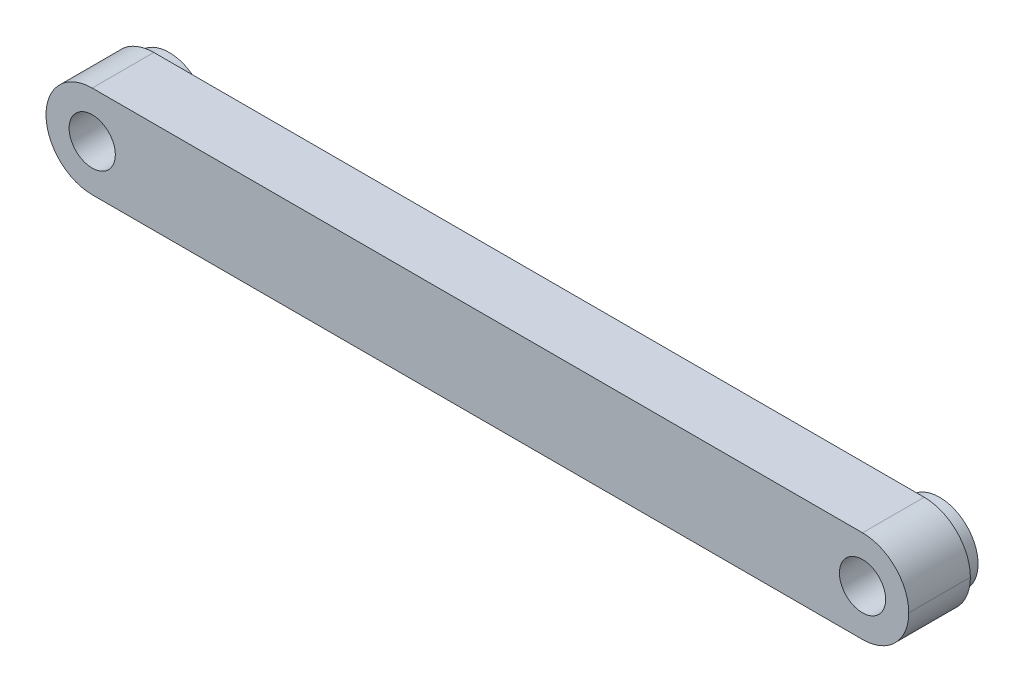
ISO-10303-21;
HEADER;
FILE_DESCRIPTION(('STEP AP214'),'2;1');
FILE_NAME('part.step','',(''),(''),'','','');
FILE_SCHEMA(('AUTOMOTIVE_DESIGN { 1 0 10303 214 1 1 1 1 }'));
ENDSEC;
DATA;
#1=APPLICATION_CONTEXT('core data for automotive mechanical design processes');
#2=APPLICATION_PROTOCOL_DEFINITION('international standard','automotive_design',2000,#1);
#3=PRODUCT_CONTEXT('',#1,'mechanical');
#4=PRODUCT('Part','Part','',(#3));
#5=PRODUCT_RELATED_PRODUCT_CATEGORY('part','',(#4));
#6=PRODUCT_DEFINITION_FORMATION('','',#4);
#7=PRODUCT_DEFINITION_CONTEXT('part definition',#1,'design');
#8=PRODUCT_DEFINITION('design','',#6,#7);
#9=PRODUCT_DEFINITION_SHAPE('','',#8);
#10=(LENGTH_UNIT() NAMED_UNIT(*) SI_UNIT(.MILLI.,.METRE.));
#11=(NAMED_UNIT(*) PLANE_ANGLE_UNIT() SI_UNIT($,.RADIAN.));
#12=(NAMED_UNIT(*) SI_UNIT($,.STERADIAN.) SOLID_ANGLE_UNIT());
#13=UNCERTAINTY_MEASURE_WITH_UNIT(LENGTH_MEASURE(1.E-05),#10,'distance_accuracy_value','');
#14=(GEOMETRIC_REPRESENTATION_CONTEXT(3) GLOBAL_UNCERTAINTY_ASSIGNED_CONTEXT((#13)) GLOBAL_UNIT_ASSIGNED_CONTEXT((#10,
#11,#12)) REPRESENTATION_CONTEXT('',''));
#15=CARTESIAN_POINT('',(0.,0.,0.));
#16=DIRECTION('',(0.,0.,1.));
#17=DIRECTION('',(1.,0.,0.));
#18=AXIS2_PLACEMENT_3D('',#15,#16,#17);
#19=CARTESIAN_POINT('',(0.,0.,0.));
#20=DIRECTION('',(0.,0.,-1.));
#21=DIRECTION('',(-1.,0.,0.));
#22=AXIS2_PLACEMENT_3D('',#19,#20,#21);
#23=PLANE('',#22);
#24=CARTESIAN_POINT('',(-25.,0.,0.));
#25=DIRECTION('',(0.,0.,-1.));
#26=DIRECTION('',(-1.,0.,0.));
#27=AXIS2_PLACEMENT_3D('',#24,#25,#26);
#28=CIRCLE('',#27,2.5);
#29=CARTESIAN_POINT('',(-27.5,0.,0.));
#30=VERTEX_POINT('',#29);
#31=EDGE_CURVE('E11',#30,#30,#28,.T.);
#32=ORIENTED_EDGE('',*,*,#31,.F.);
#33=EDGE_LOOP('',(#32));
#34=FACE_BOUND('',#33,.T.);
#35=CARTESIAN_POINT('',(25.,0.,0.));
#36=DIRECTION('',(0.,0.,-1.));
#37=DIRECTION('',(-1.,0.,0.));
#38=AXIS2_PLACEMENT_3D('',#35,#36,#37);
#39=CIRCLE('',#38,3.);
#40=CARTESIAN_POINT('',(25.,3.,0.));
#41=VERTEX_POINT('',#40);
#42=CARTESIAN_POINT('',(28.,0.,0.));
#43=VERTEX_POINT('',#42);
#44=EDGE_CURVE('E103',#41,#43,#39,.T.);
#45=ORIENTED_EDGE('',*,*,#44,.T.);
#46=CARTESIAN_POINT('',(25.,0.,0.));
#47=DIRECTION('',(0.,0.,-1.));
#48=DIRECTION('',(-1.,0.,0.));
#49=AXIS2_PLACEMENT_3D('',#46,#47,#48);
#50=CIRCLE('',#49,3.);
#51=CARTESIAN_POINT('',(25.,-3.,0.));
#52=VERTEX_POINT('',#51);
#53=EDGE_CURVE('E108',#43,#52,#50,.T.);
#54=ORIENTED_EDGE('',*,*,#53,.T.);
#55=DIRECTION('',(1.,0.,0.));
#56=VECTOR('',#55,1.);
#57=CARTESIAN_POINT('',(-28.,-3.,0.));
#58=LINE('',#57,#56);
#59=CARTESIAN_POINT('',(-25.,-3.,0.));
#60=VERTEX_POINT('',#59);
#61=EDGE_CURVE('E155',#60,#52,#58,.T.);
#62=ORIENTED_EDGE('',*,*,#61,.F.);
#63=CARTESIAN_POINT('',(-25.,0.,0.));
#64=DIRECTION('',(0.,0.,-1.));
#65=DIRECTION('',(-1.,0.,0.));
#66=AXIS2_PLACEMENT_3D('',#63,#64,#65);
#67=CIRCLE('',#66,3.);
#68=CARTESIAN_POINT('',(-28.,0.,0.));
#69=VERTEX_POINT('',#68);
#70=EDGE_CURVE('E114',#60,#69,#67,.T.);
#71=ORIENTED_EDGE('',*,*,#70,.T.);
#72=CARTESIAN_POINT('',(-25.,0.,0.));
#73=DIRECTION('',(0.,0.,-1.));
#74=DIRECTION('',(-1.,0.,0.));
#75=AXIS2_PLACEMENT_3D('',#72,#73,#74);
#76=CIRCLE('',#75,3.);
#77=CARTESIAN_POINT('',(-25.,3.,0.));
#78=VERTEX_POINT('',#77);
#79=EDGE_CURVE('E160',#69,#78,#76,.T.);
#80=ORIENTED_EDGE('',*,*,#79,.T.);
#81=DIRECTION('',(-1.,0.,0.));
#82=VECTOR('',#81,1.);
#83=CARTESIAN_POINT('',(-28.,3.,0.));
#84=LINE('',#83,#82);
#85=EDGE_CURVE('E110',#41,#78,#84,.T.);
#86=ORIENTED_EDGE('',*,*,#85,.F.);
#87=EDGE_LOOP('',(#45,#54,#62,#71,#80,#86));
#88=FACE_BOUND('',#87,.T.);
#89=CARTESIAN_POINT('',(25.,0.,0.));
#90=DIRECTION('',(0.,0.,-1.));
#91=DIRECTION('',(-1.,0.,0.));
#92=AXIS2_PLACEMENT_3D('',#89,#90,#91);
#93=CIRCLE('',#92,2.5);
#94=CARTESIAN_POINT('',(22.5,0.,0.));
#95=VERTEX_POINT('',#94);
#96=EDGE_CURVE('E191',#95,#95,#93,.T.);
#97=ORIENTED_EDGE('',*,*,#96,.F.);
#98=EDGE_LOOP('',(#97));
#99=FACE_BOUND('',#98,.T.);
#100=ADVANCED_FACE('F45',(#34,#88,#99),#23,.T.);
#101=CARTESIAN_POINT('',(0.,0.,4.));
#102=DIRECTION('',(0.,0.,-1.));
#103=DIRECTION('',(-1.,0.,0.));
#104=AXIS2_PLACEMENT_3D('',#101,#102,#103);
#105=PLANE('',#104);
#106=DIRECTION('',(1.,0.,0.));
#107=VECTOR('',#106,1.);
#108=CARTESIAN_POINT('',(-28.,-3.,4.));
#109=LINE('',#108,#107);
#110=CARTESIAN_POINT('',(-25.,-3.,4.));
#111=VERTEX_POINT('',#110);
#112=CARTESIAN_POINT('',(25.,-3.,4.));
#113=VERTEX_POINT('',#112);
#114=EDGE_CURVE('E154',#111,#113,#109,.T.);
#115=ORIENTED_EDGE('',*,*,#114,.T.);
#116=CARTESIAN_POINT('',(25.,0.,4.));
#117=DIRECTION('',(0.,0.,-1.));
#118=DIRECTION('',(-1.,0.,0.));
#119=AXIS2_PLACEMENT_3D('',#116,#117,#118);
#120=CIRCLE('',#119,3.);
#121=CARTESIAN_POINT('',(28.,0.,4.));
#122=VERTEX_POINT('',#121);
#123=EDGE_CURVE('E145',#113,#122,#120,.F.);
#124=ORIENTED_EDGE('',*,*,#123,.T.);
#125=CARTESIAN_POINT('',(25.,0.,4.));
#126=DIRECTION('',(0.,0.,-1.));
#127=DIRECTION('',(-1.,0.,0.));
#128=AXIS2_PLACEMENT_3D('',#125,#126,#127);
#129=CIRCLE('',#128,3.);
#130=CARTESIAN_POINT('',(25.,3.,4.));
#131=VERTEX_POINT('',#130);
#132=EDGE_CURVE('E120',#122,#131,#129,.F.);
#133=ORIENTED_EDGE('',*,*,#132,.T.);
#134=DIRECTION('',(-1.,0.,0.));
#135=VECTOR('',#134,1.);
#136=CARTESIAN_POINT('',(-28.,3.,4.));
#137=LINE('',#136,#135);
#138=CARTESIAN_POINT('',(-25.,3.,4.));
#139=VERTEX_POINT('',#138);
#140=EDGE_CURVE('E152',#131,#139,#137,.T.);
#141=ORIENTED_EDGE('',*,*,#140,.T.);
#142=CARTESIAN_POINT('',(-25.,0.,4.));
#143=DIRECTION('',(0.,0.,-1.));
#144=DIRECTION('',(-1.,0.,0.));
#145=AXIS2_PLACEMENT_3D('',#142,#143,#144);
#146=CIRCLE('',#145,3.);
#147=CARTESIAN_POINT('',(-28.,0.,4.));
#148=VERTEX_POINT('',#147);
#149=EDGE_CURVE('E63',#139,#148,#146,.F.);
#150=ORIENTED_EDGE('',*,*,#149,.T.);
#151=CARTESIAN_POINT('',(-25.,0.,4.));
#152=DIRECTION('',(0.,0.,-1.));
#153=DIRECTION('',(-1.,0.,0.));
#154=AXIS2_PLACEMENT_3D('',#151,#152,#153);
#155=CIRCLE('',#154,3.);
#156=EDGE_CURVE('E140',#148,#111,#155,.F.);
#157=ORIENTED_EDGE('',*,*,#156,.T.);
#158=EDGE_LOOP('',(#115,#124,#133,#141,#150,#157));
#159=FACE_BOUND('',#158,.T.);
#160=CARTESIAN_POINT('',(-25.,0.,4.));
#161=DIRECTION('',(0.,0.,1.));
#162=DIRECTION('',(1.,0.,0.));
#163=AXIS2_PLACEMENT_3D('',#160,#161,#162);
#164=CIRCLE('',#163,1.5);
#165=CARTESIAN_POINT('',(-23.5,0.,4.));
#166=VERTEX_POINT('',#165);
#167=EDGE_CURVE('E164',#166,#166,#164,.T.);
#168=ORIENTED_EDGE('',*,*,#167,.F.);
#169=EDGE_LOOP('',(#168));
#170=FACE_BOUND('',#169,.T.);
#171=CARTESIAN_POINT('',(25.,0.,4.));
#172=DIRECTION('',(0.,0.,1.));
#173=DIRECTION('',(1.,0.,0.));
#174=AXIS2_PLACEMENT_3D('',#171,#172,#173);
#175=CIRCLE('',#174,1.5);
#176=CARTESIAN_POINT('',(26.5,0.,4.));
#177=VERTEX_POINT('',#176);
#178=EDGE_CURVE('E123',#177,#177,#175,.T.);
#179=ORIENTED_EDGE('',*,*,#178,.F.);
#180=EDGE_LOOP('',(#179));
#181=FACE_BOUND('',#180,.T.);
#182=ADVANCED_FACE('F212',(#159,#170,#181),#105,.F.);
#183=CARTESIAN_POINT('',(-28.,3.,4.));
#184=DIRECTION('',(0.,-1.,0.));
#185=DIRECTION('',(0.,0.,-1.));
#186=AXIS2_PLACEMENT_3D('',#183,#184,#185);
#187=PLANE('',#186);
#188=ORIENTED_EDGE('',*,*,#140,.F.);
#189=DIRECTION('',(0.,0.,-1.));
#190=VECTOR('',#189,1.);
#191=CARTESIAN_POINT('',(25.,3.,4.));
#192=LINE('',#191,#190);
#193=EDGE_CURVE('E55',#131,#41,#192,.T.);
#194=ORIENTED_EDGE('',*,*,#193,.T.);
#195=ORIENTED_EDGE('',*,*,#85,.T.);
#196=DIRECTION('',(0.,0.,-1.));
#197=VECTOR('',#196,1.);
#198=CARTESIAN_POINT('',(-25.,3.,4.));
#199=LINE('',#198,#197);
#200=EDGE_CURVE('E71',#78,#139,#199,.F.);
#201=ORIENTED_EDGE('',*,*,#200,.T.);
#202=EDGE_LOOP('',(#188,#194,#195,#201));
#203=FACE_BOUND('',#202,.T.);
#204=ADVANCED_FACE('F151',(#203),#187,.F.);
#205=CARTESIAN_POINT('',(-28.,-3.,4.));
#206=DIRECTION('',(0.,1.,0.));
#207=DIRECTION('',(0.,0.,1.));
#208=AXIS2_PLACEMENT_3D('',#205,#206,#207);
#209=PLANE('',#208);
#210=ORIENTED_EDGE('',*,*,#61,.T.);
#211=DIRECTION('',(0.,0.,-1.));
#212=VECTOR('',#211,1.);
#213=CARTESIAN_POINT('',(25.,-3.,4.));
#214=LINE('',#213,#212);
#215=EDGE_CURVE('E127',#52,#113,#214,.F.);
#216=ORIENTED_EDGE('',*,*,#215,.T.);
#217=ORIENTED_EDGE('',*,*,#114,.F.);
#218=DIRECTION('',(0.,0.,-1.));
#219=VECTOR('',#218,1.);
#220=CARTESIAN_POINT('',(-25.,-3.,4.));
#221=LINE('',#220,#219);
#222=EDGE_CURVE('E129',#111,#60,#221,.T.);
#223=ORIENTED_EDGE('',*,*,#222,.T.);
#224=EDGE_LOOP('',(#210,#216,#217,#223));
#225=FACE_BOUND('',#224,.T.);
#226=ADVANCED_FACE('F219',(#225),#209,.F.);
#227=CARTESIAN_POINT('',(-25.,0.,4.));
#228=DIRECTION('',(0.,0.,-1.));
#229=DIRECTION('',(-1.,0.,0.));
#230=AXIS2_PLACEMENT_3D('',#227,#228,#229);
#231=CYLINDRICAL_SURFACE('',#230,1.5);
#232=ORIENTED_EDGE('',*,*,#167,.T.);
#233=EDGE_LOOP('',(#232));
#234=FACE_BOUND('',#233,.T.);
#235=CARTESIAN_POINT('',(-25.,0.,-1.));
#236=DIRECTION('',(0.,0.,-1.));
#237=DIRECTION('',(-1.,0.,0.));
#238=AXIS2_PLACEMENT_3D('',#235,#236,#237);
#239=CIRCLE('',#238,1.5);
#240=CARTESIAN_POINT('',(-26.5,0.,-1.));
#241=VERTEX_POINT('',#240);
#242=EDGE_CURVE('E182',#241,#241,#239,.T.);
#243=ORIENTED_EDGE('',*,*,#242,.T.);
#244=EDGE_LOOP('',(#243));
#245=FACE_BOUND('',#244,.T.);
#246=ADVANCED_FACE('F209',(#234,#245),#231,.F.);
#247=CARTESIAN_POINT('',(25.,0.,4.));
#248=DIRECTION('',(0.,0.,-1.));
#249=DIRECTION('',(-1.,0.,0.));
#250=AXIS2_PLACEMENT_3D('',#247,#248,#249);
#251=CYLINDRICAL_SURFACE('',#250,1.5);
#252=ORIENTED_EDGE('',*,*,#178,.T.);
#253=EDGE_LOOP('',(#252));
#254=FACE_BOUND('',#253,.T.);
#255=CARTESIAN_POINT('',(25.,0.,-1.));
#256=DIRECTION('',(0.,0.,-1.));
#257=DIRECTION('',(-1.,0.,0.));
#258=AXIS2_PLACEMENT_3D('',#255,#256,#257);
#259=CIRCLE('',#258,1.5);
#260=CARTESIAN_POINT('',(23.5,0.,-1.));
#261=VERTEX_POINT('',#260);
#262=EDGE_CURVE('E188',#261,#261,#259,.T.);
#263=ORIENTED_EDGE('',*,*,#262,.T.);
#264=EDGE_LOOP('',(#263));
#265=FACE_BOUND('',#264,.T.);
#266=ADVANCED_FACE('F233',(#254,#265),#251,.F.);
#267=CARTESIAN_POINT('',(25.,0.,4.));
#268=DIRECTION('',(0.,0.,-1.));
#269=DIRECTION('',(-1.,0.,0.));
#270=AXIS2_PLACEMENT_3D('',#267,#268,#269);
#271=CYLINDRICAL_SURFACE('',#270,3.);
#272=ORIENTED_EDGE('',*,*,#193,.F.);
#273=ORIENTED_EDGE('',*,*,#132,.F.);
#274=DIRECTION('',(0.,0.,-1.));
#275=VECTOR('',#274,1.);
#276=CARTESIAN_POINT('',(28.,0.,4.));
#277=LINE('',#276,#275);
#278=EDGE_CURVE('E118',#43,#122,#277,.F.);
#279=ORIENTED_EDGE('',*,*,#278,.F.);
#280=ORIENTED_EDGE('',*,*,#44,.F.);
#281=EDGE_LOOP('',(#272,#273,#279,#280));
#282=FACE_BOUND('',#281,.T.);
#283=ADVANCED_FACE('F119',(#282),#271,.T.);
#284=CARTESIAN_POINT('',(25.,0.,4.));
#285=DIRECTION('',(0.,0.,-1.));
#286=DIRECTION('',(-1.,0.,0.));
#287=AXIS2_PLACEMENT_3D('',#284,#285,#286);
#288=CYLINDRICAL_SURFACE('',#287,3.);
#289=ORIENTED_EDGE('',*,*,#123,.F.);
#290=ORIENTED_EDGE('',*,*,#215,.F.);
#291=ORIENTED_EDGE('',*,*,#53,.F.);
#292=ORIENTED_EDGE('',*,*,#278,.T.);
#293=EDGE_LOOP('',(#289,#290,#291,#292));
#294=FACE_BOUND('',#293,.T.);
#295=ADVANCED_FACE('F125',(#294),#288,.T.);
#296=CARTESIAN_POINT('',(-25.,0.,4.));
#297=DIRECTION('',(0.,0.,-1.));
#298=DIRECTION('',(-1.,0.,0.));
#299=AXIS2_PLACEMENT_3D('',#296,#297,#298);
#300=CYLINDRICAL_SURFACE('',#299,3.);
#301=DIRECTION('',(0.,0.,-1.));
#302=VECTOR('',#301,1.);
#303=CARTESIAN_POINT('',(-28.,0.,4.));
#304=LINE('',#303,#302);
#305=EDGE_CURVE('E49',#148,#69,#304,.T.);
#306=ORIENTED_EDGE('',*,*,#305,.F.);
#307=ORIENTED_EDGE('',*,*,#149,.F.);
#308=ORIENTED_EDGE('',*,*,#200,.F.);
#309=ORIENTED_EDGE('',*,*,#79,.F.);
#310=EDGE_LOOP('',(#306,#307,#308,#309));
#311=FACE_BOUND('',#310,.T.);
#312=ADVANCED_FACE('F47',(#311),#300,.T.);
#313=CARTESIAN_POINT('',(-25.,0.,4.));
#314=DIRECTION('',(0.,0.,-1.));
#315=DIRECTION('',(-1.,0.,0.));
#316=AXIS2_PLACEMENT_3D('',#313,#314,#315);
#317=CYLINDRICAL_SURFACE('',#316,3.);
#318=ORIENTED_EDGE('',*,*,#156,.F.);
#319=ORIENTED_EDGE('',*,*,#305,.T.);
#320=ORIENTED_EDGE('',*,*,#70,.F.);
#321=ORIENTED_EDGE('',*,*,#222,.F.);
#322=EDGE_LOOP('',(#318,#319,#320,#321));
#323=FACE_BOUND('',#322,.T.);
#324=ADVANCED_FACE('F177',(#323),#317,.T.);
#325=CARTESIAN_POINT('',(25.,0.,-1.));
#326=DIRECTION('',(0.,0.,-1.));
#327=DIRECTION('',(-1.,0.,0.));
#328=AXIS2_PLACEMENT_3D('',#325,#326,#327);
#329=PLANE('',#328);
#330=CARTESIAN_POINT('',(25.,0.,-1.));
#331=DIRECTION('',(0.,0.,-1.));
#332=DIRECTION('',(-1.,0.,0.));
#333=AXIS2_PLACEMENT_3D('',#330,#331,#332);
#334=CIRCLE('',#333,2.5);
#335=CARTESIAN_POINT('',(22.5,0.,-1.));
#336=VERTEX_POINT('',#335);
#337=EDGE_CURVE('E195',#336,#336,#334,.T.);
#338=ORIENTED_EDGE('',*,*,#337,.T.);
#339=EDGE_LOOP('',(#338));
#340=FACE_BOUND('',#339,.T.);
#341=ORIENTED_EDGE('',*,*,#262,.F.);
#342=EDGE_LOOP('',(#341));
#343=FACE_BOUND('',#342,.T.);
#344=ADVANCED_FACE('F235',(#340,#343),#329,.T.);
#345=CARTESIAN_POINT('',(25.,0.,-1.));
#346=DIRECTION('',(0.,0.,1.));
#347=DIRECTION('',(1.,0.,0.));
#348=AXIS2_PLACEMENT_3D('',#345,#346,#347);
#349=CYLINDRICAL_SURFACE('',#348,2.5);
#350=ORIENTED_EDGE('',*,*,#337,.F.);
#351=EDGE_LOOP('',(#350));
#352=FACE_BOUND('',#351,.T.);
#353=ORIENTED_EDGE('',*,*,#96,.T.);
#354=EDGE_LOOP('',(#353));
#355=FACE_BOUND('',#354,.T.);
#356=ADVANCED_FACE('F240',(#352,#355),#349,.T.);
#357=CARTESIAN_POINT('',(-25.,0.,-1.));
#358=DIRECTION('',(0.,0.,-1.));
#359=DIRECTION('',(-1.,0.,0.));
#360=AXIS2_PLACEMENT_3D('',#357,#358,#359);
#361=PLANE('',#360);
#362=CARTESIAN_POINT('',(-25.,0.,-1.));
#363=DIRECTION('',(0.,0.,-1.));
#364=DIRECTION('',(-1.,0.,0.));
#365=AXIS2_PLACEMENT_3D('',#362,#363,#364);
#366=CIRCLE('',#365,2.5);
#367=CARTESIAN_POINT('',(-27.5,0.,-1.));
#368=VERTEX_POINT('',#367);
#369=EDGE_CURVE('E179',#368,#368,#366,.T.);
#370=ORIENTED_EDGE('',*,*,#369,.T.);
#371=EDGE_LOOP('',(#370));
#372=FACE_BOUND('',#371,.T.);
#373=ORIENTED_EDGE('',*,*,#242,.F.);
#374=EDGE_LOOP('',(#373));
#375=FACE_BOUND('',#374,.T.);
#376=ADVANCED_FACE('F311',(#372,#375),#361,.T.);
#377=CARTESIAN_POINT('',(-25.,0.,-1.));
#378=DIRECTION('',(0.,0.,1.));
#379=DIRECTION('',(1.,0.,0.));
#380=AXIS2_PLACEMENT_3D('',#377,#378,#379);
#381=CYLINDRICAL_SURFACE('',#380,2.5);
#382=ORIENTED_EDGE('',*,*,#369,.F.);
#383=EDGE_LOOP('',(#382));
#384=FACE_BOUND('',#383,.T.);
#385=ORIENTED_EDGE('',*,*,#31,.T.);
#386=EDGE_LOOP('',(#385));
#387=FACE_BOUND('',#386,.T.);
#388=ADVANCED_FACE('F320',(#384,#387),#381,.T.);
#389=CLOSED_SHELL('',(#100,#182,#204,#226,#246,#266,#283,#295,#312,#324,#344,#356,#376,#388));
#390=MANIFOLD_SOLID_BREP('B2',#389);
#391=ADVANCED_BREP_SHAPE_REPRESENTATION('',(#18,#390),#14);
#392=SHAPE_DEFINITION_REPRESENTATION(#9,#391);
ENDSEC;
END-ISO-10303-21;
